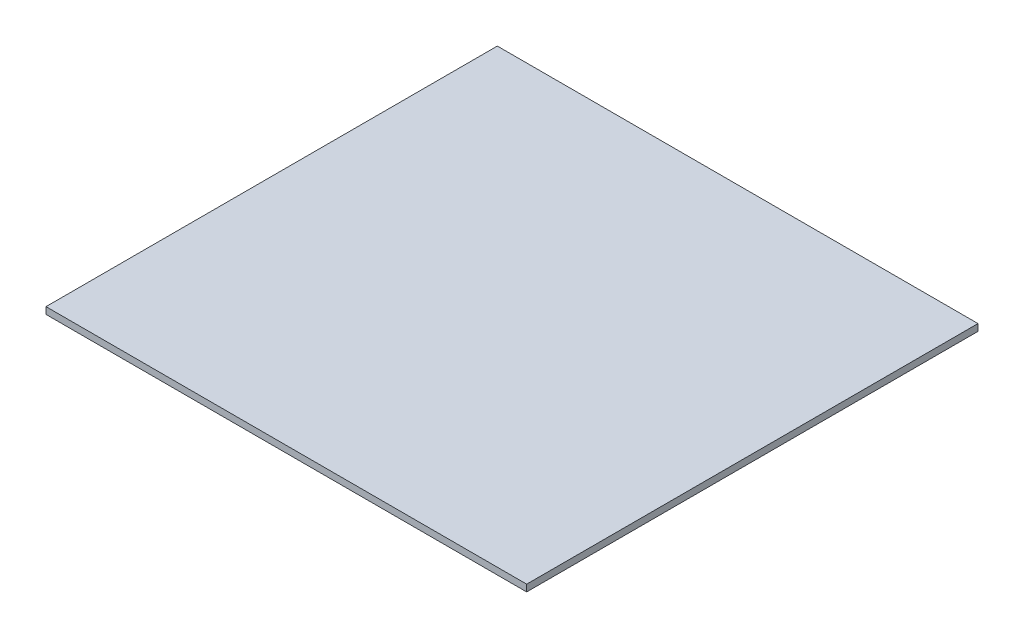
ISO-10303-21;
HEADER;
FILE_DESCRIPTION(('STEP AP214'),'2;1');
FILE_NAME('part.step','',(''),(''),'','','');
FILE_SCHEMA(('AUTOMOTIVE_DESIGN { 1 0 10303 214 1 1 1 1 }'));
ENDSEC;
DATA;
#1=APPLICATION_CONTEXT('core data for automotive mechanical design processes');
#2=APPLICATION_PROTOCOL_DEFINITION('international standard','automotive_design',2000,#1);
#3=PRODUCT_CONTEXT('',#1,'mechanical');
#4=PRODUCT('Part','Part','',(#3));
#5=PRODUCT_RELATED_PRODUCT_CATEGORY('part','',(#4));
#6=PRODUCT_DEFINITION_FORMATION('','',#4);
#7=PRODUCT_DEFINITION_CONTEXT('part definition',#1,'design');
#8=PRODUCT_DEFINITION('design','',#6,#7);
#9=PRODUCT_DEFINITION_SHAPE('','',#8);
#10=(LENGTH_UNIT() NAMED_UNIT(*) SI_UNIT(.MILLI.,.METRE.));
#11=(NAMED_UNIT(*) PLANE_ANGLE_UNIT() SI_UNIT($,.RADIAN.));
#12=(NAMED_UNIT(*) SI_UNIT($,.STERADIAN.) SOLID_ANGLE_UNIT());
#13=UNCERTAINTY_MEASURE_WITH_UNIT(LENGTH_MEASURE(1.E-05),#10,'distance_accuracy_value','');
#14=(GEOMETRIC_REPRESENTATION_CONTEXT(3) GLOBAL_UNCERTAINTY_ASSIGNED_CONTEXT((#13)) GLOBAL_UNIT_ASSIGNED_CONTEXT((#10,
#11,#12)) REPRESENTATION_CONTEXT('',''));
#15=CARTESIAN_POINT('',(0.,0.,0.));
#16=DIRECTION('',(0.,0.,1.));
#17=DIRECTION('',(1.,0.,0.));
#18=AXIS2_PLACEMENT_3D('',#15,#16,#17);
#19=CARTESIAN_POINT('',(0.,3.,0.));
#20=DIRECTION('',(1.,0.,0.));
#21=DIRECTION('',(0.,0.,-1.));
#22=AXIS2_PLACEMENT_3D('',#19,#20,#21);
#23=PLANE('',#22);
#24=DIRECTION('',(0.,0.,1.));
#25=VECTOR('',#24,1.);
#26=CARTESIAN_POINT('',(0.,0.,0.));
#27=LINE('',#26,#25);
#28=CARTESIAN_POINT('',(0.,0.,-200.));
#29=VERTEX_POINT('',#28);
#30=CARTESIAN_POINT('',(0.,0.,0.));
#31=VERTEX_POINT('',#30);
#32=EDGE_CURVE('E96',#29,#31,#27,.T.);
#33=ORIENTED_EDGE('',*,*,#32,.T.);
#34=DIRECTION('',(0.,-1.,0.));
#35=VECTOR('',#34,1.);
#36=CARTESIAN_POINT('',(0.,3.,0.));
#37=LINE('',#36,#35);
#38=CARTESIAN_POINT('',(0.,3.,0.));
#39=VERTEX_POINT('',#38);
#40=EDGE_CURVE('E11',#39,#31,#37,.T.);
#41=ORIENTED_EDGE('',*,*,#40,.F.);
#42=DIRECTION('',(0.,0.,1.));
#43=VECTOR('',#42,1.);
#44=CARTESIAN_POINT('',(0.,3.,0.));
#45=LINE('',#44,#43);
#46=CARTESIAN_POINT('',(0.,3.,-200.));
#47=VERTEX_POINT('',#46);
#48=EDGE_CURVE('E84',#47,#39,#45,.T.);
#49=ORIENTED_EDGE('',*,*,#48,.F.);
#50=DIRECTION('',(0.,-1.,0.));
#51=VECTOR('',#50,1.);
#52=CARTESIAN_POINT('',(0.,3.,-200.));
#53=LINE('',#52,#51);
#54=EDGE_CURVE('E92',#47,#29,#53,.T.);
#55=ORIENTED_EDGE('',*,*,#54,.T.);
#56=EDGE_LOOP('',(#33,#41,#49,#55));
#57=FACE_BOUND('',#56,.T.);
#58=ADVANCED_FACE('F33',(#57),#23,.F.);
#59=CARTESIAN_POINT('',(0.,3.,0.));
#60=DIRECTION('',(0.,0.,-1.));
#61=DIRECTION('',(-1.,0.,0.));
#62=AXIS2_PLACEMENT_3D('',#59,#60,#61);
#63=PLANE('',#62);
#64=DIRECTION('',(1.,0.,0.));
#65=VECTOR('',#64,1.);
#66=CARTESIAN_POINT('',(0.,0.,0.));
#67=LINE('',#66,#65);
#68=CARTESIAN_POINT('',(213.,0.,0.));
#69=VERTEX_POINT('',#68);
#70=EDGE_CURVE('E88',#31,#69,#67,.T.);
#71=ORIENTED_EDGE('',*,*,#70,.T.);
#72=DIRECTION('',(0.,-1.,0.));
#73=VECTOR('',#72,1.);
#74=CARTESIAN_POINT('',(213.,3.,0.));
#75=LINE('',#74,#73);
#76=CARTESIAN_POINT('',(213.,3.,0.));
#77=VERTEX_POINT('',#76);
#78=EDGE_CURVE('E41',#77,#69,#75,.T.);
#79=ORIENTED_EDGE('',*,*,#78,.F.);
#80=DIRECTION('',(1.,0.,0.));
#81=VECTOR('',#80,1.);
#82=CARTESIAN_POINT('',(0.,3.,0.));
#83=LINE('',#82,#81);
#84=EDGE_CURVE('E79',#39,#77,#83,.T.);
#85=ORIENTED_EDGE('',*,*,#84,.F.);
#86=ORIENTED_EDGE('',*,*,#40,.T.);
#87=EDGE_LOOP('',(#71,#79,#85,#86));
#88=FACE_BOUND('',#87,.T.);
#89=ADVANCED_FACE('F87',(#88),#63,.F.);
#90=CARTESIAN_POINT('',(213.,3.,0.));
#91=DIRECTION('',(-1.,0.,0.));
#92=DIRECTION('',(0.,0.,1.));
#93=AXIS2_PLACEMENT_3D('',#90,#91,#92);
#94=PLANE('',#93);
#95=DIRECTION('',(0.,0.,-1.));
#96=VECTOR('',#95,1.);
#97=CARTESIAN_POINT('',(213.,0.,0.));
#98=LINE('',#97,#96);
#99=CARTESIAN_POINT('',(213.,0.,-200.));
#100=VERTEX_POINT('',#99);
#101=EDGE_CURVE('E66',#69,#100,#98,.T.);
#102=ORIENTED_EDGE('',*,*,#101,.T.);
#103=DIRECTION('',(0.,-1.,0.));
#104=VECTOR('',#103,1.);
#105=CARTESIAN_POINT('',(213.,3.,-200.));
#106=LINE('',#105,#104);
#107=CARTESIAN_POINT('',(213.,3.,-200.));
#108=VERTEX_POINT('',#107);
#109=EDGE_CURVE('E89',#108,#100,#106,.T.);
#110=ORIENTED_EDGE('',*,*,#109,.F.);
#111=DIRECTION('',(0.,0.,-1.));
#112=VECTOR('',#111,1.);
#113=CARTESIAN_POINT('',(213.,3.,0.));
#114=LINE('',#113,#112);
#115=EDGE_CURVE('E82',#77,#108,#114,.T.);
#116=ORIENTED_EDGE('',*,*,#115,.F.);
#117=ORIENTED_EDGE('',*,*,#78,.T.);
#118=EDGE_LOOP('',(#102,#110,#116,#117));
#119=FACE_BOUND('',#118,.T.);
#120=ADVANCED_FACE('F90',(#119),#94,.F.);
#121=CARTESIAN_POINT('',(0.,3.,-200.));
#122=DIRECTION('',(0.,0.,1.));
#123=DIRECTION('',(1.,0.,0.));
#124=AXIS2_PLACEMENT_3D('',#121,#122,#123);
#125=PLANE('',#124);
#126=DIRECTION('',(-1.,0.,0.));
#127=VECTOR('',#126,1.);
#128=CARTESIAN_POINT('',(0.,0.,-200.));
#129=LINE('',#128,#127);
#130=EDGE_CURVE('E72',#100,#29,#129,.T.);
#131=ORIENTED_EDGE('',*,*,#130,.T.);
#132=ORIENTED_EDGE('',*,*,#54,.F.);
#133=DIRECTION('',(-1.,0.,0.));
#134=VECTOR('',#133,1.);
#135=CARTESIAN_POINT('',(0.,3.,-200.));
#136=LINE('',#135,#134);
#137=EDGE_CURVE('E49',#108,#47,#136,.T.);
#138=ORIENTED_EDGE('',*,*,#137,.F.);
#139=ORIENTED_EDGE('',*,*,#109,.T.);
#140=EDGE_LOOP('',(#131,#132,#138,#139));
#141=FACE_BOUND('',#140,.T.);
#142=ADVANCED_FACE('F103',(#141),#125,.F.);
#143=CARTESIAN_POINT('',(0.,3.,0.));
#144=DIRECTION('',(0.,-1.,0.));
#145=DIRECTION('',(0.,0.,-1.));
#146=AXIS2_PLACEMENT_3D('',#143,#144,#145);
#147=PLANE('',#146);
#148=ORIENTED_EDGE('',*,*,#48,.T.);
#149=ORIENTED_EDGE('',*,*,#84,.T.);
#150=ORIENTED_EDGE('',*,*,#115,.T.);
#151=ORIENTED_EDGE('',*,*,#137,.T.);
#152=EDGE_LOOP('',(#148,#149,#150,#151));
#153=FACE_BOUND('',#152,.T.);
#154=ADVANCED_FACE('F80',(#153),#147,.F.);
#155=CARTESIAN_POINT('',(0.,0.,0.));
#156=DIRECTION('',(0.,-1.,0.));
#157=DIRECTION('',(0.,0.,-1.));
#158=AXIS2_PLACEMENT_3D('',#155,#156,#157);
#159=PLANE('',#158);
#160=ORIENTED_EDGE('',*,*,#32,.F.);
#161=ORIENTED_EDGE('',*,*,#130,.F.);
#162=ORIENTED_EDGE('',*,*,#101,.F.);
#163=ORIENTED_EDGE('',*,*,#70,.F.);
#164=EDGE_LOOP('',(#160,#161,#162,#163));
#165=FACE_BOUND('',#164,.T.);
#166=ADVANCED_FACE('F106',(#165),#159,.T.);
#167=CLOSED_SHELL('',(#58,#89,#120,#142,#154,#166));
#168=MANIFOLD_SOLID_BREP('B2',#167);
#169=ADVANCED_BREP_SHAPE_REPRESENTATION('',(#18,#168),#14);
#170=SHAPE_DEFINITION_REPRESENTATION(#9,#169);
ENDSEC;
END-ISO-10303-21;
